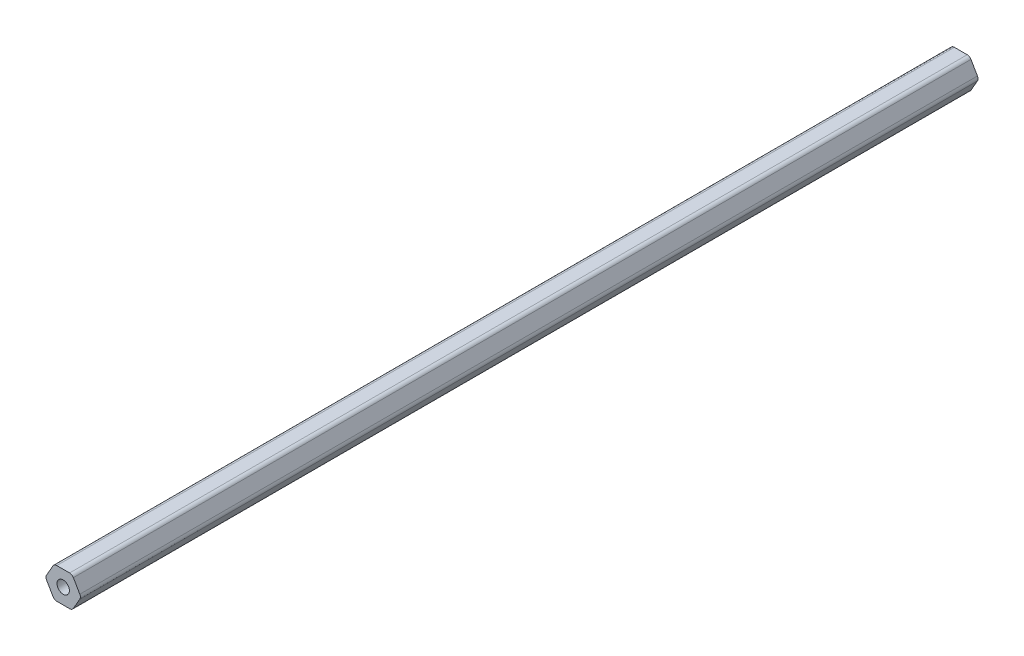
ISO-10303-21;
HEADER;
FILE_DESCRIPTION(('STEP AP214'),'2;1');
FILE_NAME('part.step','',(''),(''),'','','');
FILE_SCHEMA(('AUTOMOTIVE_DESIGN { 1 0 10303 214 1 1 1 1 }'));
ENDSEC;
DATA;
#1=APPLICATION_CONTEXT('core data for automotive mechanical design processes');
#2=APPLICATION_PROTOCOL_DEFINITION('international standard','automotive_design',2000,#1);
#3=PRODUCT_CONTEXT('',#1,'mechanical');
#4=PRODUCT('Part','Part','',(#3));
#5=PRODUCT_RELATED_PRODUCT_CATEGORY('part','',(#4));
#6=PRODUCT_DEFINITION_FORMATION('','',#4);
#7=PRODUCT_DEFINITION_CONTEXT('part definition',#1,'design');
#8=PRODUCT_DEFINITION('design','',#6,#7);
#9=PRODUCT_DEFINITION_SHAPE('','',#8);
#10=(LENGTH_UNIT() NAMED_UNIT(*) SI_UNIT(.MILLI.,.METRE.));
#11=(NAMED_UNIT(*) PLANE_ANGLE_UNIT() SI_UNIT($,.RADIAN.));
#12=(NAMED_UNIT(*) SI_UNIT($,.STERADIAN.) SOLID_ANGLE_UNIT());
#13=UNCERTAINTY_MEASURE_WITH_UNIT(LENGTH_MEASURE(1.E-05),#10,'distance_accuracy_value','');
#14=(GEOMETRIC_REPRESENTATION_CONTEXT(3) GLOBAL_UNCERTAINTY_ASSIGNED_CONTEXT((#13)) GLOBAL_UNIT_ASSIGNED_CONTEXT((#10,
#11,#12)) REPRESENTATION_CONTEXT('',''));
#15=CARTESIAN_POINT('',(0.,0.,0.));
#16=DIRECTION('',(0.,0.,1.));
#17=DIRECTION('',(1.,0.,0.));
#18=AXIS2_PLACEMENT_3D('',#15,#16,#17);
#19=CARTESIAN_POINT('',(0.,0.,368.3));
#20=DIRECTION('',(0.,0.,1.));
#21=DIRECTION('',(1.,0.,0.));
#22=AXIS2_PLACEMENT_3D('',#19,#20,#21);
#23=PLANE('',#22);
#24=DIRECTION('',(0.500000000000007,-0.866025403784434,0.));
#25=VECTOR('',#24,1.);
#26=CARTESIAN_POINT('',(-9.05968049811549,0.370142588444359,368.3));
#27=LINE('',#26,#25);
#28=CARTESIAN_POINT('',(-8.5464161088059,-0.51885741155564,368.3));
#29=VERTEX_POINT('',#28);
#30=CARTESIAN_POINT('',(-5.90677067807088,-5.09085741155563,368.3));
#31=VERTEX_POINT('',#30);
#32=EDGE_CURVE('E236',#29,#31,#27,.T.);
#33=ORIENTED_EDGE('',*,*,#32,.T.);
#34=CARTESIAN_POINT('',(-4.36697751014216,-4.20185741155562,368.3));
#35=DIRECTION('',(0.,0.,1.));
#36=DIRECTION('',(1.,0.,0.));
#37=AXIS2_PLACEMENT_3D('',#34,#35,#36);
#38=CIRCLE('',#37,1.778);
#39=CARTESIAN_POINT('',(-4.36697751014214,-5.97985741155562,368.3));
#40=VERTEX_POINT('',#39);
#41=EDGE_CURVE('E210',#31,#40,#38,.T.);
#42=ORIENTED_EDGE('',*,*,#41,.T.);
#43=DIRECTION('',(1.,0.,0.));
#44=VECTOR('',#43,1.);
#45=CARTESIAN_POINT('',(-5.3935062887613,-5.97985741155563,368.3));
#46=LINE('',#45,#44);
#47=CARTESIAN_POINT('',(0.91231335132782,-5.97985741155556,368.3));
#48=VERTEX_POINT('',#47);
#49=EDGE_CURVE('E155',#40,#48,#46,.T.);
#50=ORIENTED_EDGE('',*,*,#49,.T.);
#51=CARTESIAN_POINT('',(0.912313351327801,-4.20185741155556,368.3));
#52=DIRECTION('',(0.,0.,1.));
#53=DIRECTION('',(1.,0.,0.));
#54=AXIS2_PLACEMENT_3D('',#51,#52,#53);
#55=CIRCLE('',#54,1.778);
#56=CARTESIAN_POINT('',(2.45210651925654,-5.09085741155555,368.3));
#57=VERTEX_POINT('',#56);
#58=EDGE_CURVE('E207',#48,#57,#55,.T.);
#59=ORIENTED_EDGE('',*,*,#58,.T.);
#60=DIRECTION('',(0.499999999999995,0.866025403784441,0.));
#61=VECTOR('',#60,1.);
#62=CARTESIAN_POINT('',(1.93884212994697,-5.97985741155555,368.3));
#63=LINE('',#62,#61);
#64=CARTESIAN_POINT('',(5.09175194999145,-0.518857411555588,368.3));
#65=VERTEX_POINT('',#64);
#66=EDGE_CURVE('E164',#57,#65,#63,.T.);
#67=ORIENTED_EDGE('',*,*,#66,.T.);
#68=CARTESIAN_POINT('',(3.55195878206271,0.370142588444404,368.3));
#69=DIRECTION('',(0.,0.,1.));
#70=DIRECTION('',(1.,0.,0.));
#71=AXIS2_PLACEMENT_3D('',#68,#69,#70);
#72=CIRCLE('',#71,1.778);
#73=CARTESIAN_POINT('',(5.09175194999145,1.25914258844441,368.3));
#74=VERTEX_POINT('',#73);
#75=EDGE_CURVE('E204',#65,#74,#72,.T.);
#76=ORIENTED_EDGE('',*,*,#75,.T.);
#77=DIRECTION('',(-0.500000000000001,0.866025403784438,0.));
#78=VECTOR('',#77,1.);
#79=CARTESIAN_POINT('',(5.60501633930102,0.37014258844441,368.3));
#80=LINE('',#79,#78);
#81=CARTESIAN_POINT('',(2.45210651925646,5.83114258844442,368.3));
#82=VERTEX_POINT('',#81);
#83=EDGE_CURVE('E170',#74,#82,#80,.T.);
#84=ORIENTED_EDGE('',*,*,#83,.T.);
#85=CARTESIAN_POINT('',(0.912313351327729,4.94214258844442,368.3));
#86=DIRECTION('',(0.,0.,1.));
#87=DIRECTION('',(1.,0.,0.));
#88=AXIS2_PLACEMENT_3D('',#85,#86,#87);
#89=CIRCLE('',#88,1.778);
#90=CARTESIAN_POINT('',(0.912313351327723,6.72014258844442,368.3));
#91=VERTEX_POINT('',#90);
#92=EDGE_CURVE('E201',#82,#91,#89,.T.);
#93=ORIENTED_EDGE('',*,*,#92,.T.);
#94=DIRECTION('',(-1.,0.,0.));
#95=VECTOR('',#94,1.);
#96=CARTESIAN_POINT('',(1.93884212994688,6.72014258844442,368.3));
#97=LINE('',#96,#95);
#98=CARTESIAN_POINT('',(-4.36697751014223,6.7201425884444,368.3));
#99=VERTEX_POINT('',#98);
#100=EDGE_CURVE('E243',#91,#99,#97,.T.);
#101=ORIENTED_EDGE('',*,*,#100,.T.);
#102=CARTESIAN_POINT('',(-4.36697751014222,4.9421425884444,368.3));
#103=DIRECTION('',(0.,0.,1.));
#104=DIRECTION('',(1.,0.,0.));
#105=AXIS2_PLACEMENT_3D('',#102,#103,#104);
#106=CIRCLE('',#105,1.778);
#107=CARTESIAN_POINT('',(-5.90677067807096,5.83114258844439,368.3));
#108=VERTEX_POINT('',#107);
#109=EDGE_CURVE('E65',#99,#108,#106,.T.);
#110=ORIENTED_EDGE('',*,*,#109,.T.);
#111=DIRECTION('',(-0.499999999999995,-0.866025403784441,0.));
#112=VECTOR('',#111,1.);
#113=CARTESIAN_POINT('',(-5.39350628876139,6.7201425884444,368.3));
#114=LINE('',#113,#112);
#115=CARTESIAN_POINT('',(-8.54641610880591,1.25914258844436,368.3));
#116=VERTEX_POINT('',#115);
#117=EDGE_CURVE('E240',#108,#116,#114,.T.);
#118=ORIENTED_EDGE('',*,*,#117,.T.);
#119=CARTESIAN_POINT('',(-7.00662294087717,0.370142588444373,368.3));
#120=DIRECTION('',(0.,0.,1.));
#121=DIRECTION('',(1.,0.,0.));
#122=AXIS2_PLACEMENT_3D('',#119,#120,#121);
#123=CIRCLE('',#122,1.778);
#124=EDGE_CURVE('E196',#116,#29,#123,.T.);
#125=ORIENTED_EDGE('',*,*,#124,.T.);
#126=EDGE_LOOP('',(#33,#42,#50,#59,#67,#76,#84,#93,#101,#110,#118,#125));
#127=FACE_BOUND('',#126,.T.);
#128=CARTESIAN_POINT('',(-1.72733207940723,0.37014258844441,368.3));
#129=DIRECTION('',(0.,0.,1.));
#130=DIRECTION('',(1.,0.,0.));
#131=AXIS2_PLACEMENT_3D('',#128,#129,#130);
#132=CIRCLE('',#131,2.54);
#133=CARTESIAN_POINT('',(0.812667920592769,0.37014258844441,368.3));
#134=VERTEX_POINT('',#133);
#135=EDGE_CURVE('E258',#134,#134,#132,.T.);
#136=ORIENTED_EDGE('',*,*,#135,.F.);
#137=EDGE_LOOP('',(#136));
#138=FACE_BOUND('',#137,.T.);
#139=ADVANCED_FACE('F43',(#127,#138),#23,.T.);
#140=CARTESIAN_POINT('',(0.,0.,0.));
#141=DIRECTION('',(0.,0.,1.));
#142=DIRECTION('',(1.,0.,0.));
#143=AXIS2_PLACEMENT_3D('',#140,#141,#142);
#144=PLANE('',#143);
#145=DIRECTION('',(1.,0.,0.));
#146=VECTOR('',#145,1.);
#147=CARTESIAN_POINT('',(-5.3935062887613,-5.97985741155563,0.));
#148=LINE('',#147,#146);
#149=CARTESIAN_POINT('',(-4.36697751014214,-5.97985741155562,0.));
#150=VERTEX_POINT('',#149);
#151=CARTESIAN_POINT('',(0.91231335132782,-5.97985741155556,0.));
#152=VERTEX_POINT('',#151);
#153=EDGE_CURVE('E152',#150,#152,#148,.T.);
#154=ORIENTED_EDGE('',*,*,#153,.F.);
#155=CARTESIAN_POINT('',(-4.36697751014216,-4.20185741155562,0.));
#156=DIRECTION('',(0.,0.,1.));
#157=DIRECTION('',(1.,0.,0.));
#158=AXIS2_PLACEMENT_3D('',#155,#156,#157);
#159=CIRCLE('',#158,1.778);
#160=CARTESIAN_POINT('',(-5.90677067807088,-5.09085741155563,0.));
#161=VERTEX_POINT('',#160);
#162=EDGE_CURVE('E134',#150,#161,#159,.F.);
#163=ORIENTED_EDGE('',*,*,#162,.T.);
#164=DIRECTION('',(0.500000000000007,-0.866025403784434,0.));
#165=VECTOR('',#164,1.);
#166=CARTESIAN_POINT('',(-9.05968049811549,0.370142588444359,0.));
#167=LINE('',#166,#165);
#168=CARTESIAN_POINT('',(-8.5464161088059,-0.51885741155564,0.));
#169=VERTEX_POINT('',#168);
#170=EDGE_CURVE('E165',#169,#161,#167,.T.);
#171=ORIENTED_EDGE('',*,*,#170,.F.);
#172=CARTESIAN_POINT('',(-7.00662294087717,0.370142588444373,0.));
#173=DIRECTION('',(0.,0.,1.));
#174=DIRECTION('',(1.,0.,0.));
#175=AXIS2_PLACEMENT_3D('',#172,#173,#174);
#176=CIRCLE('',#175,1.778);
#177=CARTESIAN_POINT('',(-8.54641610880591,1.25914258844436,0.));
#178=VERTEX_POINT('',#177);
#179=EDGE_CURVE('E157',#169,#178,#176,.F.);
#180=ORIENTED_EDGE('',*,*,#179,.T.);
#181=DIRECTION('',(-0.499999999999995,-0.866025403784441,0.));
#182=VECTOR('',#181,1.);
#183=CARTESIAN_POINT('',(-5.39350628876139,6.7201425884444,0.));
#184=LINE('',#183,#182);
#185=CARTESIAN_POINT('',(-5.90677067807096,5.83114258844439,0.));
#186=VERTEX_POINT('',#185);
#187=EDGE_CURVE('E172',#186,#178,#184,.T.);
#188=ORIENTED_EDGE('',*,*,#187,.F.);
#189=CARTESIAN_POINT('',(-4.36697751014222,4.9421425884444,0.));
#190=DIRECTION('',(0.,0.,1.));
#191=DIRECTION('',(1.,0.,0.));
#192=AXIS2_PLACEMENT_3D('',#189,#190,#191);
#193=CIRCLE('',#192,1.778);
#194=CARTESIAN_POINT('',(-4.36697751014223,6.7201425884444,0.));
#195=VERTEX_POINT('',#194);
#196=EDGE_CURVE('E180',#186,#195,#193,.F.);
#197=ORIENTED_EDGE('',*,*,#196,.T.);
#198=DIRECTION('',(-1.,0.,0.));
#199=VECTOR('',#198,1.);
#200=CARTESIAN_POINT('',(1.93884212994688,6.72014258844442,0.));
#201=LINE('',#200,#199);
#202=CARTESIAN_POINT('',(0.912313351327723,6.72014258844442,0.));
#203=VERTEX_POINT('',#202);
#204=EDGE_CURVE('E262',#203,#195,#201,.T.);
#205=ORIENTED_EDGE('',*,*,#204,.F.);
#206=CARTESIAN_POINT('',(0.912313351327729,4.94214258844442,0.));
#207=DIRECTION('',(0.,0.,1.));
#208=DIRECTION('',(1.,0.,0.));
#209=AXIS2_PLACEMENT_3D('',#206,#207,#208);
#210=CIRCLE('',#209,1.778);
#211=CARTESIAN_POINT('',(2.45210651925646,5.83114258844442,0.));
#212=VERTEX_POINT('',#211);
#213=EDGE_CURVE('E183',#203,#212,#210,.F.);
#214=ORIENTED_EDGE('',*,*,#213,.T.);
#215=DIRECTION('',(-0.500000000000001,0.866025403784438,0.));
#216=VECTOR('',#215,1.);
#217=CARTESIAN_POINT('',(5.60501633930102,0.37014258844441,0.));
#218=LINE('',#217,#216);
#219=CARTESIAN_POINT('',(5.09175194999145,1.25914258844441,0.));
#220=VERTEX_POINT('',#219);
#221=EDGE_CURVE('E257',#220,#212,#218,.T.);
#222=ORIENTED_EDGE('',*,*,#221,.F.);
#223=CARTESIAN_POINT('',(3.55195878206271,0.370142588444404,0.));
#224=DIRECTION('',(0.,0.,1.));
#225=DIRECTION('',(1.,0.,0.));
#226=AXIS2_PLACEMENT_3D('',#223,#224,#225);
#227=CIRCLE('',#226,1.778);
#228=CARTESIAN_POINT('',(5.09175194999145,-0.518857411555588,0.));
#229=VERTEX_POINT('',#228);
#230=EDGE_CURVE('E186',#220,#229,#227,.F.);
#231=ORIENTED_EDGE('',*,*,#230,.T.);
#232=DIRECTION('',(0.499999999999995,0.866025403784441,0.));
#233=VECTOR('',#232,1.);
#234=CARTESIAN_POINT('',(1.93884212994697,-5.97985741155555,0.));
#235=LINE('',#234,#233);
#236=CARTESIAN_POINT('',(2.45210651925654,-5.09085741155555,0.));
#237=VERTEX_POINT('',#236);
#238=EDGE_CURVE('E253',#237,#229,#235,.T.);
#239=ORIENTED_EDGE('',*,*,#238,.F.);
#240=CARTESIAN_POINT('',(0.912313351327801,-4.20185741155556,0.));
#241=DIRECTION('',(0.,0.,1.));
#242=DIRECTION('',(1.,0.,0.));
#243=AXIS2_PLACEMENT_3D('',#240,#241,#242);
#244=CIRCLE('',#243,1.778);
#245=EDGE_CURVE('E146',#237,#152,#244,.F.);
#246=ORIENTED_EDGE('',*,*,#245,.T.);
#247=EDGE_LOOP('',(#154,#163,#171,#180,#188,#197,#205,#214,#222,#231,#239,#246));
#248=FACE_BOUND('',#247,.T.);
#249=CARTESIAN_POINT('',(-1.72733207940723,0.37014258844441,0.));
#250=DIRECTION('',(0.,0.,1.));
#251=DIRECTION('',(1.,0.,0.));
#252=AXIS2_PLACEMENT_3D('',#249,#250,#251);
#253=CIRCLE('',#252,2.54);
#254=CARTESIAN_POINT('',(0.812667920592769,0.37014258844441,0.));
#255=VERTEX_POINT('',#254);
#256=EDGE_CURVE('E306',#255,#255,#253,.T.);
#257=ORIENTED_EDGE('',*,*,#256,.T.);
#258=EDGE_LOOP('',(#257));
#259=FACE_BOUND('',#258,.T.);
#260=ADVANCED_FACE('F160',(#248,#259),#144,.F.);
#261=CARTESIAN_POINT('',(1.93884212994697,-5.97985741155555,368.3));
#262=DIRECTION('',(-0.866025403784441,0.499999999999995,0.));
#263=DIRECTION('',(-0.499999999999995,-0.866025403784442,0.));
#264=AXIS2_PLACEMENT_3D('',#261,#262,#263);
#265=PLANE('',#264);
#266=ORIENTED_EDGE('',*,*,#66,.F.);
#267=DIRECTION('',(0.,0.,-1.));
#268=VECTOR('',#267,1.);
#269=CARTESIAN_POINT('',(2.45210651925654,-5.09085741155555,368.3));
#270=LINE('',#269,#268);
#271=EDGE_CURVE('E216',#57,#237,#270,.T.);
#272=ORIENTED_EDGE('',*,*,#271,.T.);
#273=ORIENTED_EDGE('',*,*,#238,.T.);
#274=DIRECTION('',(0.,0.,-1.));
#275=VECTOR('',#274,1.);
#276=CARTESIAN_POINT('',(5.09175194999145,-0.518857411555588,368.3));
#277=LINE('',#276,#275);
#278=EDGE_CURVE('E213',#229,#65,#277,.F.);
#279=ORIENTED_EDGE('',*,*,#278,.T.);
#280=EDGE_LOOP('',(#266,#272,#273,#279));
#281=FACE_BOUND('',#280,.T.);
#282=ADVANCED_FACE('F291',(#281),#265,.F.);
#283=CARTESIAN_POINT('',(5.60501633930102,0.37014258844441,368.3));
#284=DIRECTION('',(-0.866025403784438,-0.500000000000001,0.));
#285=DIRECTION('',(0.500000000000001,-0.866025403784438,0.));
#286=AXIS2_PLACEMENT_3D('',#283,#284,#285);
#287=PLANE('',#286);
#288=ORIENTED_EDGE('',*,*,#83,.F.);
#289=DIRECTION('',(0.,0.,-1.));
#290=VECTOR('',#289,1.);
#291=CARTESIAN_POINT('',(5.09175194999145,1.25914258844441,368.3));
#292=LINE('',#291,#290);
#293=EDGE_CURVE('E223',#74,#220,#292,.T.);
#294=ORIENTED_EDGE('',*,*,#293,.T.);
#295=ORIENTED_EDGE('',*,*,#221,.T.);
#296=DIRECTION('',(0.,0.,-1.));
#297=VECTOR('',#296,1.);
#298=CARTESIAN_POINT('',(2.45210651925646,5.83114258844442,368.3));
#299=LINE('',#298,#297);
#300=EDGE_CURVE('E220',#212,#82,#299,.F.);
#301=ORIENTED_EDGE('',*,*,#300,.T.);
#302=EDGE_LOOP('',(#288,#294,#295,#301));
#303=FACE_BOUND('',#302,.T.);
#304=ADVANCED_FACE('F339',(#303),#287,.F.);
#305=CARTESIAN_POINT('',(1.93884212994688,6.72014258844442,368.3));
#306=DIRECTION('',(0.,-1.,0.));
#307=DIRECTION('',(1.,0.,0.));
#308=AXIS2_PLACEMENT_3D('',#305,#306,#307);
#309=PLANE('',#308);
#310=ORIENTED_EDGE('',*,*,#100,.F.);
#311=DIRECTION('',(0.,0.,-1.));
#312=VECTOR('',#311,1.);
#313=CARTESIAN_POINT('',(0.912313351327723,6.72014258844442,368.3));
#314=LINE('',#313,#312);
#315=EDGE_CURVE('E230',#91,#203,#314,.T.);
#316=ORIENTED_EDGE('',*,*,#315,.T.);
#317=ORIENTED_EDGE('',*,*,#204,.T.);
#318=DIRECTION('',(0.,0.,-1.));
#319=VECTOR('',#318,1.);
#320=CARTESIAN_POINT('',(-4.36697751014223,6.7201425884444,368.3));
#321=LINE('',#320,#319);
#322=EDGE_CURVE('E227',#195,#99,#321,.F.);
#323=ORIENTED_EDGE('',*,*,#322,.T.);
#324=EDGE_LOOP('',(#310,#316,#317,#323));
#325=FACE_BOUND('',#324,.T.);
#326=ADVANCED_FACE('F284',(#325),#309,.F.);
#327=CARTESIAN_POINT('',(-5.39350628876139,6.7201425884444,368.3));
#328=DIRECTION('',(0.866025403784441,-0.499999999999995,0.));
#329=DIRECTION('',(0.499999999999995,0.866025403784441,0.));
#330=AXIS2_PLACEMENT_3D('',#327,#328,#329);
#331=PLANE('',#330);
#332=ORIENTED_EDGE('',*,*,#117,.F.);
#333=DIRECTION('',(0.,0.,-1.));
#334=VECTOR('',#333,1.);
#335=CARTESIAN_POINT('',(-5.90677067807096,5.83114258844439,368.3));
#336=LINE('',#335,#334);
#337=EDGE_CURVE('E11',#108,#186,#336,.T.);
#338=ORIENTED_EDGE('',*,*,#337,.T.);
#339=ORIENTED_EDGE('',*,*,#187,.T.);
#340=DIRECTION('',(0.,0.,-1.));
#341=VECTOR('',#340,1.);
#342=CARTESIAN_POINT('',(-8.54641610880591,1.25914258844437,368.3));
#343=LINE('',#342,#341);
#344=EDGE_CURVE('E52',#178,#116,#343,.F.);
#345=ORIENTED_EDGE('',*,*,#344,.T.);
#346=EDGE_LOOP('',(#332,#338,#339,#345));
#347=FACE_BOUND('',#346,.T.);
#348=ADVANCED_FACE('F267',(#347),#331,.F.);
#349=CARTESIAN_POINT('',(-9.05968049811549,0.370142588444359,368.3));
#350=DIRECTION('',(0.866025403784434,0.500000000000007,0.));
#351=DIRECTION('',(-0.500000000000007,0.866025403784435,0.));
#352=AXIS2_PLACEMENT_3D('',#349,#350,#351);
#353=PLANE('',#352);
#354=ORIENTED_EDGE('',*,*,#170,.T.);
#355=DIRECTION('',(0.,0.,-1.));
#356=VECTOR('',#355,1.);
#357=CARTESIAN_POINT('',(-5.90677067807088,-5.09085741155563,368.3));
#358=LINE('',#357,#356);
#359=EDGE_CURVE('E139',#161,#31,#358,.F.);
#360=ORIENTED_EDGE('',*,*,#359,.T.);
#361=ORIENTED_EDGE('',*,*,#32,.F.);
#362=DIRECTION('',(0.,0.,-1.));
#363=VECTOR('',#362,1.);
#364=CARTESIAN_POINT('',(-8.5464161088059,-0.51885741155564,368.3));
#365=LINE('',#364,#363);
#366=EDGE_CURVE('E145',#29,#169,#365,.T.);
#367=ORIENTED_EDGE('',*,*,#366,.T.);
#368=EDGE_LOOP('',(#354,#360,#361,#367));
#369=FACE_BOUND('',#368,.T.);
#370=ADVANCED_FACE('F275',(#369),#353,.F.);
#371=CARTESIAN_POINT('',(-5.3935062887613,-5.97985741155563,368.3));
#372=DIRECTION('',(0.,1.,0.));
#373=DIRECTION('',(-1.,0.,0.));
#374=AXIS2_PLACEMENT_3D('',#371,#372,#373);
#375=PLANE('',#374);
#376=ORIENTED_EDGE('',*,*,#49,.F.);
#377=DIRECTION('',(0.,0.,-1.));
#378=VECTOR('',#377,1.);
#379=CARTESIAN_POINT('',(-4.36697751014214,-5.97985741155562,368.3));
#380=LINE('',#379,#378);
#381=EDGE_CURVE('E138',#40,#150,#380,.T.);
#382=ORIENTED_EDGE('',*,*,#381,.T.);
#383=ORIENTED_EDGE('',*,*,#153,.T.);
#384=DIRECTION('',(0.,0.,-1.));
#385=VECTOR('',#384,1.);
#386=CARTESIAN_POINT('',(0.91231335132782,-5.97985741155556,368.3));
#387=LINE('',#386,#385);
#388=EDGE_CURVE('E158',#152,#48,#387,.F.);
#389=ORIENTED_EDGE('',*,*,#388,.T.);
#390=EDGE_LOOP('',(#376,#382,#383,#389));
#391=FACE_BOUND('',#390,.T.);
#392=ADVANCED_FACE('F151',(#391),#375,.F.);
#393=CARTESIAN_POINT('',(-1.72733207940723,0.37014258844441,368.3));
#394=DIRECTION('',(0.,0.,-1.));
#395=DIRECTION('',(-1.,0.,0.));
#396=AXIS2_PLACEMENT_3D('',#393,#394,#395);
#397=CYLINDRICAL_SURFACE('',#396,2.54);
#398=ORIENTED_EDGE('',*,*,#135,.T.);
#399=EDGE_LOOP('',(#398));
#400=FACE_BOUND('',#399,.T.);
#401=ORIENTED_EDGE('',*,*,#256,.F.);
#402=EDGE_LOOP('',(#401));
#403=FACE_BOUND('',#402,.T.);
#404=ADVANCED_FACE('F282',(#400,#403),#397,.F.);
#405=CARTESIAN_POINT('',(-4.36697751014216,-4.20185741155562,368.3));
#406=DIRECTION('',(0.,0.,-1.));
#407=DIRECTION('',(-1.,0.,0.));
#408=AXIS2_PLACEMENT_3D('',#405,#406,#407);
#409=CYLINDRICAL_SURFACE('',#408,1.778);
#410=ORIENTED_EDGE('',*,*,#41,.F.);
#411=ORIENTED_EDGE('',*,*,#359,.F.);
#412=ORIENTED_EDGE('',*,*,#162,.F.);
#413=ORIENTED_EDGE('',*,*,#381,.F.);
#414=EDGE_LOOP('',(#410,#411,#412,#413));
#415=FACE_BOUND('',#414,.T.);
#416=ADVANCED_FACE('F137',(#415),#409,.T.);
#417=CARTESIAN_POINT('',(0.912313351327801,-4.20185741155556,368.3));
#418=DIRECTION('',(0.,0.,-1.));
#419=DIRECTION('',(-1.,0.,0.));
#420=AXIS2_PLACEMENT_3D('',#417,#418,#419);
#421=CYLINDRICAL_SURFACE('',#420,1.778);
#422=ORIENTED_EDGE('',*,*,#58,.F.);
#423=ORIENTED_EDGE('',*,*,#388,.F.);
#424=ORIENTED_EDGE('',*,*,#245,.F.);
#425=ORIENTED_EDGE('',*,*,#271,.F.);
#426=EDGE_LOOP('',(#422,#423,#424,#425));
#427=FACE_BOUND('',#426,.T.);
#428=ADVANCED_FACE('F299',(#427),#421,.T.);
#429=CARTESIAN_POINT('',(3.55195878206271,0.370142588444404,368.3));
#430=DIRECTION('',(0.,0.,-1.));
#431=DIRECTION('',(-1.,0.,0.));
#432=AXIS2_PLACEMENT_3D('',#429,#430,#431);
#433=CYLINDRICAL_SURFACE('',#432,1.778);
#434=ORIENTED_EDGE('',*,*,#75,.F.);
#435=ORIENTED_EDGE('',*,*,#278,.F.);
#436=ORIENTED_EDGE('',*,*,#230,.F.);
#437=ORIENTED_EDGE('',*,*,#293,.F.);
#438=EDGE_LOOP('',(#434,#435,#436,#437));
#439=FACE_BOUND('',#438,.T.);
#440=ADVANCED_FACE('F313',(#439),#433,.T.);
#441=CARTESIAN_POINT('',(0.912313351327729,4.94214258844442,368.3));
#442=DIRECTION('',(0.,0.,-1.));
#443=DIRECTION('',(-1.,0.,0.));
#444=AXIS2_PLACEMENT_3D('',#441,#442,#443);
#445=CYLINDRICAL_SURFACE('',#444,1.778);
#446=ORIENTED_EDGE('',*,*,#92,.F.);
#447=ORIENTED_EDGE('',*,*,#300,.F.);
#448=ORIENTED_EDGE('',*,*,#213,.F.);
#449=ORIENTED_EDGE('',*,*,#315,.F.);
#450=EDGE_LOOP('',(#446,#447,#448,#449));
#451=FACE_BOUND('',#450,.T.);
#452=ADVANCED_FACE('F321',(#451),#445,.T.);
#453=CARTESIAN_POINT('',(-4.36697751014222,4.9421425884444,368.3));
#454=DIRECTION('',(0.,0.,-1.));
#455=DIRECTION('',(-1.,0.,0.));
#456=AXIS2_PLACEMENT_3D('',#453,#454,#455);
#457=CYLINDRICAL_SURFACE('',#456,1.778);
#458=ORIENTED_EDGE('',*,*,#109,.F.);
#459=ORIENTED_EDGE('',*,*,#322,.F.);
#460=ORIENTED_EDGE('',*,*,#196,.F.);
#461=ORIENTED_EDGE('',*,*,#337,.F.);
#462=EDGE_LOOP('',(#458,#459,#460,#461));
#463=FACE_BOUND('',#462,.T.);
#464=ADVANCED_FACE('F324',(#463),#457,.T.);
#465=CARTESIAN_POINT('',(-7.00662294087717,0.370142588444373,368.3));
#466=DIRECTION('',(0.,0.,-1.));
#467=DIRECTION('',(-1.,0.,0.));
#468=AXIS2_PLACEMENT_3D('',#465,#466,#467);
#469=CYLINDRICAL_SURFACE('',#468,1.778);
#470=ORIENTED_EDGE('',*,*,#124,.F.);
#471=ORIENTED_EDGE('',*,*,#344,.F.);
#472=ORIENTED_EDGE('',*,*,#179,.F.);
#473=ORIENTED_EDGE('',*,*,#366,.F.);
#474=EDGE_LOOP('',(#470,#471,#472,#473));
#475=FACE_BOUND('',#474,.T.);
#476=ADVANCED_FACE('F45',(#475),#469,.T.);
#477=CLOSED_SHELL('',(#139,#260,#282,#304,#326,#348,#370,#392,#404,#416,#428,#440,#452,#464,#476));
#478=MANIFOLD_SOLID_BREP('B2',#477);
#479=ADVANCED_BREP_SHAPE_REPRESENTATION('',(#18,#478),#14);
#480=SHAPE_DEFINITION_REPRESENTATION(#9,#479);
ENDSEC;
END-ISO-10303-21;
